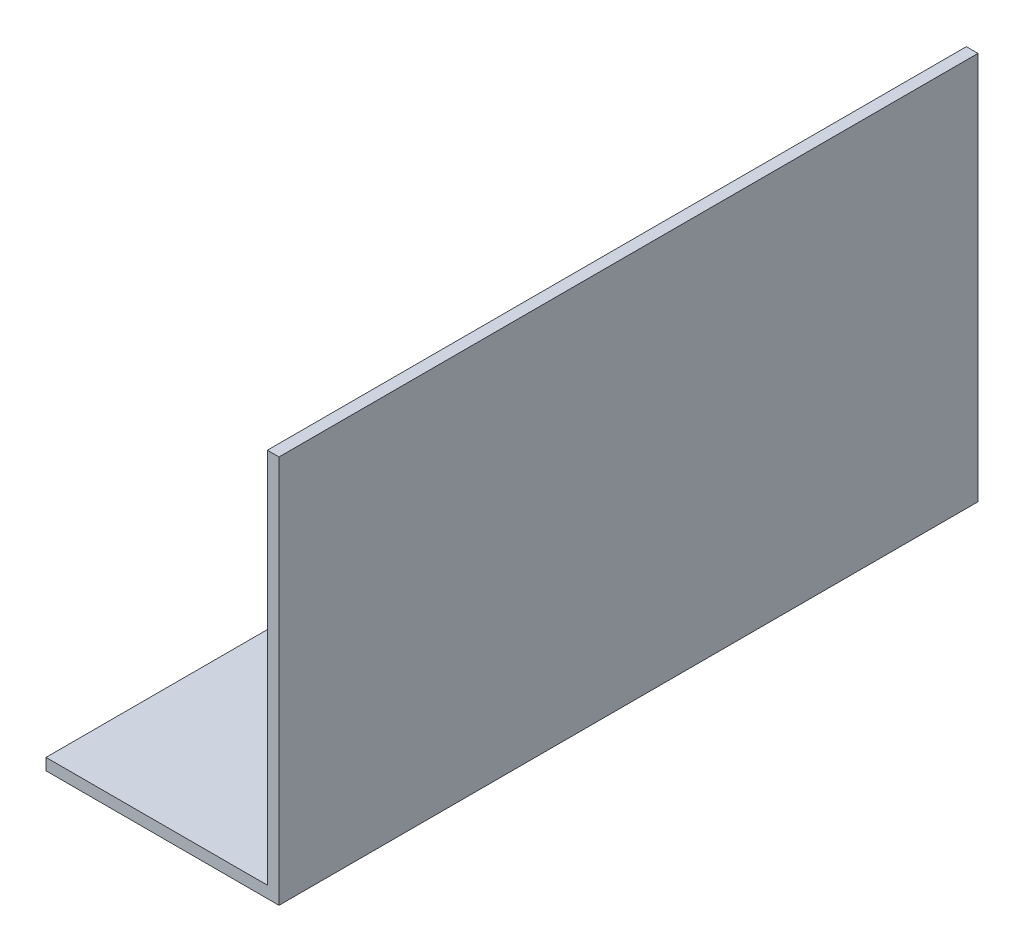
ISO-10303-21;
HEADER;
FILE_DESCRIPTION(('STEP AP214'),'2;1');
FILE_NAME('part.step','',(''),(''),'','','');
FILE_SCHEMA(('AUTOMOTIVE_DESIGN { 1 0 10303 214 1 1 1 1 }'));
ENDSEC;
DATA;
#1=APPLICATION_CONTEXT('core data for automotive mechanical design processes');
#2=APPLICATION_PROTOCOL_DEFINITION('international standard','automotive_design',2000,#1);
#3=PRODUCT_CONTEXT('',#1,'mechanical');
#4=PRODUCT('Part','Part','',(#3));
#5=PRODUCT_RELATED_PRODUCT_CATEGORY('part','',(#4));
#6=PRODUCT_DEFINITION_FORMATION('','',#4);
#7=PRODUCT_DEFINITION_CONTEXT('part definition',#1,'design');
#8=PRODUCT_DEFINITION('design','',#6,#7);
#9=PRODUCT_DEFINITION_SHAPE('','',#8);
#10=(LENGTH_UNIT() NAMED_UNIT(*) SI_UNIT(.MILLI.,.METRE.));
#11=(NAMED_UNIT(*) PLANE_ANGLE_UNIT() SI_UNIT($,.RADIAN.));
#12=(NAMED_UNIT(*) SI_UNIT($,.STERADIAN.) SOLID_ANGLE_UNIT());
#13=UNCERTAINTY_MEASURE_WITH_UNIT(LENGTH_MEASURE(1.E-05),#10,'distance_accuracy_value','');
#14=(GEOMETRIC_REPRESENTATION_CONTEXT(3) GLOBAL_UNCERTAINTY_ASSIGNED_CONTEXT((#13)) GLOBAL_UNIT_ASSIGNED_CONTEXT((#10,
#11,#12)) REPRESENTATION_CONTEXT('',''));
#15=CARTESIAN_POINT('',(0.,0.,0.));
#16=DIRECTION('',(0.,0.,1.));
#17=DIRECTION('',(1.,0.,0.));
#18=AXIS2_PLACEMENT_3D('',#15,#16,#17);
#19=CARTESIAN_POINT('',(-12.181480377546,-30.3344858420268,180.));
#20=DIRECTION('',(1.,0.,0.));
#21=DIRECTION('',(0.,0.,-1.));
#22=AXIS2_PLACEMENT_3D('',#19,#20,#21);
#23=PLANE('',#22);
#24=DIRECTION('',(0.,-1.,0.));
#25=VECTOR('',#24,1.);
#26=CARTESIAN_POINT('',(-12.181480377546,-30.3344858420268,0.));
#27=LINE('',#26,#25);
#28=CARTESIAN_POINT('',(-12.181480377546,-30.3344858420268,0.));
#29=VERTEX_POINT('',#28);
#30=CARTESIAN_POINT('',(-12.181480377546,-33.3344858420268,0.));
#31=VERTEX_POINT('',#30);
#32=EDGE_CURVE('E125',#29,#31,#27,.T.);
#33=ORIENTED_EDGE('',*,*,#32,.T.);
#34=DIRECTION('',(0.,0.,-1.));
#35=VECTOR('',#34,1.);
#36=CARTESIAN_POINT('',(-12.181480377546,-33.3344858420268,180.));
#37=LINE('',#36,#35);
#38=CARTESIAN_POINT('',(-12.181480377546,-33.3344858420268,180.));
#39=VERTEX_POINT('',#38);
#40=EDGE_CURVE('E11',#39,#31,#37,.T.);
#41=ORIENTED_EDGE('',*,*,#40,.F.);
#42=DIRECTION('',(0.,-1.,0.));
#43=VECTOR('',#42,1.);
#44=CARTESIAN_POINT('',(-12.181480377546,-30.3344858420268,180.));
#45=LINE('',#44,#43);
#46=CARTESIAN_POINT('',(-12.181480377546,-30.3344858420268,180.));
#47=VERTEX_POINT('',#46);
#48=EDGE_CURVE('E135',#47,#39,#45,.T.);
#49=ORIENTED_EDGE('',*,*,#48,.F.);
#50=DIRECTION('',(0.,0.,-1.));
#51=VECTOR('',#50,1.);
#52=CARTESIAN_POINT('',(-12.181480377546,-30.3344858420268,180.));
#53=LINE('',#52,#51);
#54=EDGE_CURVE('E121',#47,#29,#53,.T.);
#55=ORIENTED_EDGE('',*,*,#54,.T.);
#56=EDGE_LOOP('',(#33,#41,#49,#55));
#57=FACE_BOUND('',#56,.T.);
#58=ADVANCED_FACE('F41',(#57),#23,.F.);
#59=CARTESIAN_POINT('',(-12.181480377546,-33.3344858420268,180.));
#60=DIRECTION('',(0.,1.,0.));
#61=DIRECTION('',(-1.,0.,0.));
#62=AXIS2_PLACEMENT_3D('',#59,#60,#61);
#63=PLANE('',#62);
#64=DIRECTION('',(1.,0.,0.));
#65=VECTOR('',#64,1.);
#66=CARTESIAN_POINT('',(-12.181480377546,-33.3344858420268,0.));
#67=LINE('',#66,#65);
#68=CARTESIAN_POINT('',(47.818519622454,-33.3344858420268,0.));
#69=VERTEX_POINT('',#68);
#70=EDGE_CURVE('E128',#31,#69,#67,.T.);
#71=ORIENTED_EDGE('',*,*,#70,.T.);
#72=DIRECTION('',(0.,0.,-1.));
#73=VECTOR('',#72,1.);
#74=CARTESIAN_POINT('',(47.818519622454,-33.3344858420268,180.));
#75=LINE('',#74,#73);
#76=CARTESIAN_POINT('',(47.818519622454,-33.3344858420268,180.));
#77=VERTEX_POINT('',#76);
#78=EDGE_CURVE('E49',#77,#69,#75,.T.);
#79=ORIENTED_EDGE('',*,*,#78,.F.);
#80=DIRECTION('',(1.,0.,0.));
#81=VECTOR('',#80,1.);
#82=CARTESIAN_POINT('',(-12.181480377546,-33.3344858420268,180.));
#83=LINE('',#82,#81);
#84=EDGE_CURVE('E94',#39,#77,#83,.T.);
#85=ORIENTED_EDGE('',*,*,#84,.F.);
#86=ORIENTED_EDGE('',*,*,#40,.T.);
#87=EDGE_LOOP('',(#71,#79,#85,#86));
#88=FACE_BOUND('',#87,.T.);
#89=ADVANCED_FACE('F159',(#88),#63,.F.);
#90=CARTESIAN_POINT('',(47.818519622454,-33.3344858420268,180.));
#91=DIRECTION('',(-1.,0.,0.));
#92=DIRECTION('',(0.,0.,1.));
#93=AXIS2_PLACEMENT_3D('',#90,#91,#92);
#94=PLANE('',#93);
#95=DIRECTION('',(0.,1.,0.));
#96=VECTOR('',#95,1.);
#97=CARTESIAN_POINT('',(47.818519622454,-33.3344858420268,0.));
#98=LINE('',#97,#96);
#99=CARTESIAN_POINT('',(47.818519622454,66.6655141579732,0.));
#100=VERTEX_POINT('',#99);
#101=EDGE_CURVE('E130',#69,#100,#98,.T.);
#102=ORIENTED_EDGE('',*,*,#101,.T.);
#103=DIRECTION('',(0.,0.,-1.));
#104=VECTOR('',#103,1.);
#105=CARTESIAN_POINT('',(47.818519622454,66.6655141579732,180.));
#106=LINE('',#105,#104);
#107=CARTESIAN_POINT('',(47.818519622454,66.6655141579732,180.));
#108=VERTEX_POINT('',#107);
#109=EDGE_CURVE('E116',#108,#100,#106,.T.);
#110=ORIENTED_EDGE('',*,*,#109,.F.);
#111=DIRECTION('',(0.,1.,0.));
#112=VECTOR('',#111,1.);
#113=CARTESIAN_POINT('',(47.818519622454,-33.3344858420268,180.));
#114=LINE('',#113,#112);
#115=EDGE_CURVE('E107',#77,#108,#114,.T.);
#116=ORIENTED_EDGE('',*,*,#115,.F.);
#117=ORIENTED_EDGE('',*,*,#78,.T.);
#118=EDGE_LOOP('',(#102,#110,#116,#117));
#119=FACE_BOUND('',#118,.T.);
#120=ADVANCED_FACE('F141',(#119),#94,.F.);
#121=CARTESIAN_POINT('',(44.818519622454,66.6655141579732,180.));
#122=DIRECTION('',(0.,-1.,0.));
#123=DIRECTION('',(0.,0.,-1.));
#124=AXIS2_PLACEMENT_3D('',#121,#122,#123);
#125=PLANE('',#124);
#126=DIRECTION('',(-1.,0.,0.));
#127=VECTOR('',#126,1.);
#128=CARTESIAN_POINT('',(44.818519622454,66.6655141579732,0.));
#129=LINE('',#128,#127);
#130=CARTESIAN_POINT('',(44.818519622454,66.6655141579732,0.));
#131=VERTEX_POINT('',#130);
#132=EDGE_CURVE('E115',#100,#131,#129,.T.);
#133=ORIENTED_EDGE('',*,*,#132,.T.);
#134=DIRECTION('',(0.,0.,-1.));
#135=VECTOR('',#134,1.);
#136=CARTESIAN_POINT('',(44.818519622454,66.6655141579732,180.));
#137=LINE('',#136,#135);
#138=CARTESIAN_POINT('',(44.818519622454,66.6655141579732,180.));
#139=VERTEX_POINT('',#138);
#140=EDGE_CURVE('E112',#139,#131,#137,.T.);
#141=ORIENTED_EDGE('',*,*,#140,.F.);
#142=DIRECTION('',(-1.,0.,0.));
#143=VECTOR('',#142,1.);
#144=CARTESIAN_POINT('',(44.818519622454,66.6655141579732,180.));
#145=LINE('',#144,#143);
#146=EDGE_CURVE('E101',#108,#139,#145,.T.);
#147=ORIENTED_EDGE('',*,*,#146,.F.);
#148=ORIENTED_EDGE('',*,*,#109,.T.);
#149=EDGE_LOOP('',(#133,#141,#147,#148));
#150=FACE_BOUND('',#149,.T.);
#151=ADVANCED_FACE('F113',(#150),#125,.F.);
#152=CARTESIAN_POINT('',(44.818519622454,-30.3344858420268,180.));
#153=DIRECTION('',(1.,0.,0.));
#154=DIRECTION('',(0.,0.,-1.));
#155=AXIS2_PLACEMENT_3D('',#152,#153,#154);
#156=PLANE('',#155);
#157=DIRECTION('',(0.,-1.,0.));
#158=VECTOR('',#157,1.);
#159=CARTESIAN_POINT('',(44.818519622454,-30.3344858420268,0.));
#160=LINE('',#159,#158);
#161=CARTESIAN_POINT('',(44.818519622454,-30.3344858420268,0.));
#162=VERTEX_POINT('',#161);
#163=EDGE_CURVE('E80',#131,#162,#160,.T.);
#164=ORIENTED_EDGE('',*,*,#163,.T.);
#165=DIRECTION('',(0.,0.,-1.));
#166=VECTOR('',#165,1.);
#167=CARTESIAN_POINT('',(44.818519622454,-30.3344858420268,180.));
#168=LINE('',#167,#166);
#169=CARTESIAN_POINT('',(44.818519622454,-30.3344858420268,180.));
#170=VERTEX_POINT('',#169);
#171=EDGE_CURVE('E117',#170,#162,#168,.T.);
#172=ORIENTED_EDGE('',*,*,#171,.F.);
#173=DIRECTION('',(0.,-1.,0.));
#174=VECTOR('',#173,1.);
#175=CARTESIAN_POINT('',(44.818519622454,-30.3344858420268,180.));
#176=LINE('',#175,#174);
#177=EDGE_CURVE('E105',#139,#170,#176,.T.);
#178=ORIENTED_EDGE('',*,*,#177,.F.);
#179=ORIENTED_EDGE('',*,*,#140,.T.);
#180=EDGE_LOOP('',(#164,#172,#178,#179));
#181=FACE_BOUND('',#180,.T.);
#182=ADVANCED_FACE('F119',(#181),#156,.F.);
#183=CARTESIAN_POINT('',(-12.181480377546,-30.3344858420268,180.));
#184=DIRECTION('',(0.,-1.,0.));
#185=DIRECTION('',(0.,0.,-1.));
#186=AXIS2_PLACEMENT_3D('',#183,#184,#185);
#187=PLANE('',#186);
#188=DIRECTION('',(-1.,0.,0.));
#189=VECTOR('',#188,1.);
#190=CARTESIAN_POINT('',(-12.181480377546,-30.3344858420268,0.));
#191=LINE('',#190,#189);
#192=EDGE_CURVE('E86',#162,#29,#191,.T.);
#193=ORIENTED_EDGE('',*,*,#192,.T.);
#194=ORIENTED_EDGE('',*,*,#54,.F.);
#195=DIRECTION('',(-1.,0.,0.));
#196=VECTOR('',#195,1.);
#197=CARTESIAN_POINT('',(-12.181480377546,-30.3344858420268,180.));
#198=LINE('',#197,#196);
#199=EDGE_CURVE('E57',#170,#47,#198,.T.);
#200=ORIENTED_EDGE('',*,*,#199,.F.);
#201=ORIENTED_EDGE('',*,*,#171,.T.);
#202=EDGE_LOOP('',(#193,#194,#200,#201));
#203=FACE_BOUND('',#202,.T.);
#204=ADVANCED_FACE('F148',(#203),#187,.F.);
#205=CARTESIAN_POINT('',(0.,0.,180.));
#206=DIRECTION('',(0.,0.,1.));
#207=DIRECTION('',(1.,0.,0.));
#208=AXIS2_PLACEMENT_3D('',#205,#206,#207);
#209=PLANE('',#208);
#210=ORIENTED_EDGE('',*,*,#48,.T.);
#211=ORIENTED_EDGE('',*,*,#84,.T.);
#212=ORIENTED_EDGE('',*,*,#115,.T.);
#213=ORIENTED_EDGE('',*,*,#146,.T.);
#214=ORIENTED_EDGE('',*,*,#177,.T.);
#215=ORIENTED_EDGE('',*,*,#199,.T.);
#216=EDGE_LOOP('',(#210,#211,#212,#213,#214,#215));
#217=FACE_BOUND('',#216,.T.);
#218=ADVANCED_FACE('F103',(#217),#209,.T.);
#219=CARTESIAN_POINT('',(0.,0.,0.));
#220=DIRECTION('',(0.,0.,1.));
#221=DIRECTION('',(1.,0.,0.));
#222=AXIS2_PLACEMENT_3D('',#219,#220,#221);
#223=PLANE('',#222);
#224=ORIENTED_EDGE('',*,*,#32,.F.);
#225=ORIENTED_EDGE('',*,*,#192,.F.);
#226=ORIENTED_EDGE('',*,*,#163,.F.);
#227=ORIENTED_EDGE('',*,*,#132,.F.);
#228=ORIENTED_EDGE('',*,*,#101,.F.);
#229=ORIENTED_EDGE('',*,*,#70,.F.);
#230=EDGE_LOOP('',(#224,#225,#226,#227,#228,#229));
#231=FACE_BOUND('',#230,.T.);
#232=ADVANCED_FACE('F144',(#231),#223,.F.);
#233=CLOSED_SHELL('',(#58,#89,#120,#151,#182,#204,#218,#232));
#234=MANIFOLD_SOLID_BREP('B2',#233);
#235=ADVANCED_BREP_SHAPE_REPRESENTATION('',(#18,#234),#14);
#236=SHAPE_DEFINITION_REPRESENTATION(#9,#235);
ENDSEC;
END-ISO-10303-21;
